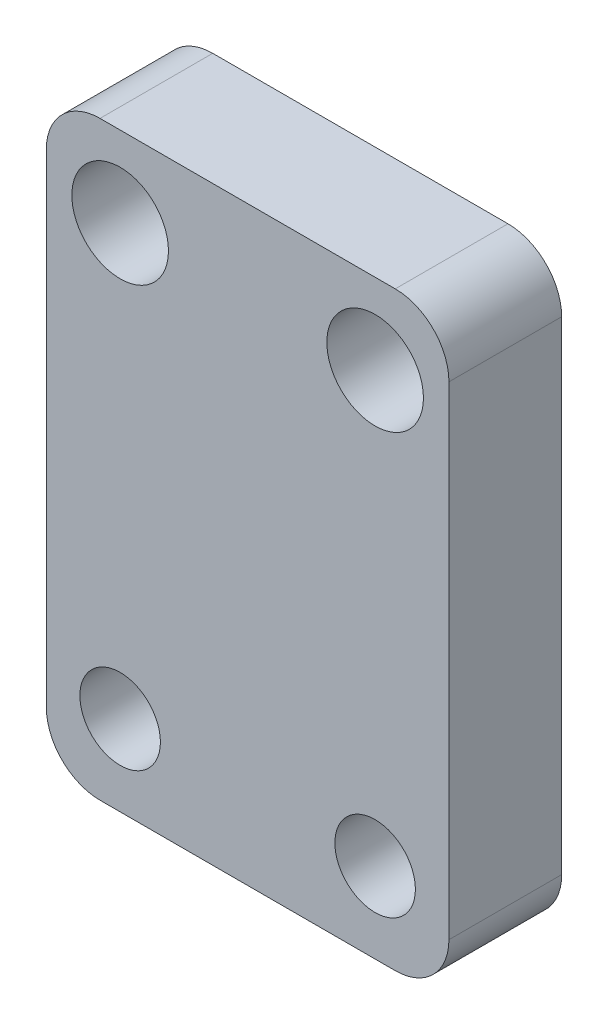
ISO-10303-21;
HEADER;
FILE_DESCRIPTION(('STEP AP214'),'2;1');
FILE_NAME('part.step','',(''),(''),'','','');
FILE_SCHEMA(('AUTOMOTIVE_DESIGN { 1 0 10303 214 1 1 1 1 }'));
ENDSEC;
DATA;
#1=APPLICATION_CONTEXT('core data for automotive mechanical design processes');
#2=APPLICATION_PROTOCOL_DEFINITION('international standard','automotive_design',2000,#1);
#3=PRODUCT_CONTEXT('',#1,'mechanical');
#4=PRODUCT('Part','Part','',(#3));
#5=PRODUCT_RELATED_PRODUCT_CATEGORY('part','',(#4));
#6=PRODUCT_DEFINITION_FORMATION('','',#4);
#7=PRODUCT_DEFINITION_CONTEXT('part definition',#1,'design');
#8=PRODUCT_DEFINITION('design','',#6,#7);
#9=PRODUCT_DEFINITION_SHAPE('','',#8);
#10=(LENGTH_UNIT() NAMED_UNIT(*) SI_UNIT(.MILLI.,.METRE.));
#11=(NAMED_UNIT(*) PLANE_ANGLE_UNIT() SI_UNIT($,.RADIAN.));
#12=(NAMED_UNIT(*) SI_UNIT($,.STERADIAN.) SOLID_ANGLE_UNIT());
#13=UNCERTAINTY_MEASURE_WITH_UNIT(LENGTH_MEASURE(1.E-05),#10,'distance_accuracy_value','');
#14=(GEOMETRIC_REPRESENTATION_CONTEXT(3) GLOBAL_UNCERTAINTY_ASSIGNED_CONTEXT((#13)) GLOBAL_UNIT_ASSIGNED_CONTEXT((#10,
#11,#12)) REPRESENTATION_CONTEXT('',''));
#15=CARTESIAN_POINT('',(0.,0.,0.));
#16=DIRECTION('',(0.,0.,1.));
#17=DIRECTION('',(1.,0.,0.));
#18=AXIS2_PLACEMENT_3D('',#15,#16,#17);
#19=CARTESIAN_POINT('',(0.,0.,4.2));
#20=DIRECTION('',(0.,0.,-1.));
#21=DIRECTION('',(-1.,0.,0.));
#22=AXIS2_PLACEMENT_3D('',#19,#20,#21);
#23=PLANE('',#22);
#24=DIRECTION('',(1.,0.,0.));
#25=VECTOR('',#24,1.);
#26=CARTESIAN_POINT('',(-7.5,-11.,4.2));
#27=LINE('',#26,#25);
#28=CARTESIAN_POINT('',(-5.5,-11.,4.2));
#29=VERTEX_POINT('',#28);
#30=CARTESIAN_POINT('',(5.5,-11.,4.2));
#31=VERTEX_POINT('',#30);
#32=EDGE_CURVE('E156',#29,#31,#27,.T.);
#33=ORIENTED_EDGE('',*,*,#32,.T.);
#34=CARTESIAN_POINT('',(5.5,-9.,4.2));
#35=DIRECTION('',(0.,0.,-1.));
#36=DIRECTION('',(-1.,0.,0.));
#37=AXIS2_PLACEMENT_3D('',#34,#35,#36);
#38=CIRCLE('',#37,2.);
#39=CARTESIAN_POINT('',(7.5,-9.,4.2));
#40=VERTEX_POINT('',#39);
#41=EDGE_CURVE('E185',#31,#40,#38,.F.);
#42=ORIENTED_EDGE('',*,*,#41,.T.);
#43=DIRECTION('',(0.,1.,0.));
#44=VECTOR('',#43,1.);
#45=CARTESIAN_POINT('',(7.5,-11.,4.2));
#46=LINE('',#45,#44);
#47=CARTESIAN_POINT('',(7.5,8.99999999999999,4.2));
#48=VERTEX_POINT('',#47);
#49=EDGE_CURVE('E134',#40,#48,#46,.T.);
#50=ORIENTED_EDGE('',*,*,#49,.T.);
#51=CARTESIAN_POINT('',(5.5,9.,4.2));
#52=DIRECTION('',(0.,0.,-1.));
#53=DIRECTION('',(-1.,0.,0.));
#54=AXIS2_PLACEMENT_3D('',#51,#52,#53);
#55=CIRCLE('',#54,2.);
#56=CARTESIAN_POINT('',(5.5,11.,4.2));
#57=VERTEX_POINT('',#56);
#58=EDGE_CURVE('E179',#48,#57,#55,.F.);
#59=ORIENTED_EDGE('',*,*,#58,.T.);
#60=DIRECTION('',(-1.,0.,0.));
#61=VECTOR('',#60,1.);
#62=CARTESIAN_POINT('',(-7.5,11.,4.2));
#63=LINE('',#62,#61);
#64=CARTESIAN_POINT('',(-5.5,11.,4.2));
#65=VERTEX_POINT('',#64);
#66=EDGE_CURVE('E198',#57,#65,#63,.T.);
#67=ORIENTED_EDGE('',*,*,#66,.T.);
#68=CARTESIAN_POINT('',(-5.5,8.99999999999999,4.2));
#69=DIRECTION('',(0.,0.,-1.));
#70=DIRECTION('',(-1.,0.,0.));
#71=AXIS2_PLACEMENT_3D('',#68,#69,#70);
#72=CIRCLE('',#71,2.);
#73=CARTESIAN_POINT('',(-7.5,8.99999999999999,4.2));
#74=VERTEX_POINT('',#73);
#75=EDGE_CURVE('E68',#65,#74,#72,.F.);
#76=ORIENTED_EDGE('',*,*,#75,.T.);
#77=DIRECTION('',(0.,-1.,0.));
#78=VECTOR('',#77,1.);
#79=CARTESIAN_POINT('',(-7.5,-11.,4.2));
#80=LINE('',#79,#78);
#81=CARTESIAN_POINT('',(-7.5,-9.,4.2));
#82=VERTEX_POINT('',#81);
#83=EDGE_CURVE('E205',#74,#82,#80,.T.);
#84=ORIENTED_EDGE('',*,*,#83,.T.);
#85=CARTESIAN_POINT('',(-5.5,-9.,4.2));
#86=DIRECTION('',(0.,0.,-1.));
#87=DIRECTION('',(-1.,0.,0.));
#88=AXIS2_PLACEMENT_3D('',#85,#86,#87);
#89=CIRCLE('',#88,2.);
#90=EDGE_CURVE('E182',#82,#29,#89,.F.);
#91=ORIENTED_EDGE('',*,*,#90,.T.);
#92=EDGE_LOOP('',(#33,#42,#50,#59,#67,#76,#84,#91));
#93=FACE_BOUND('',#92,.T.);
#94=CARTESIAN_POINT('',(-4.75,8.,4.2));
#95=DIRECTION('',(0.,0.,1.));
#96=DIRECTION('',(1.,0.,0.));
#97=AXIS2_PLACEMENT_3D('',#94,#95,#96);
#98=CIRCLE('',#97,1.8);
#99=CARTESIAN_POINT('',(-2.95,8.,4.2));
#100=VERTEX_POINT('',#99);
#101=EDGE_CURVE('E145',#100,#100,#98,.T.);
#102=ORIENTED_EDGE('',*,*,#101,.F.);
#103=EDGE_LOOP('',(#102));
#104=FACE_BOUND('',#103,.T.);
#105=CARTESIAN_POINT('',(4.75,8.,4.2));
#106=DIRECTION('',(0.,0.,1.));
#107=DIRECTION('',(1.,0.,0.));
#108=AXIS2_PLACEMENT_3D('',#105,#106,#107);
#109=CIRCLE('',#108,1.8);
#110=CARTESIAN_POINT('',(6.55,8.,4.2));
#111=VERTEX_POINT('',#110);
#112=EDGE_CURVE('E224',#111,#111,#109,.T.);
#113=ORIENTED_EDGE('',*,*,#112,.F.);
#114=EDGE_LOOP('',(#113));
#115=FACE_BOUND('',#114,.T.);
#116=CARTESIAN_POINT('',(-4.75,-8.,4.2));
#117=DIRECTION('',(0.,0.,1.));
#118=DIRECTION('',(1.,0.,0.));
#119=AXIS2_PLACEMENT_3D('',#116,#117,#118);
#120=CIRCLE('',#119,1.5);
#121=CARTESIAN_POINT('',(-3.25,-8.,4.2));
#122=VERTEX_POINT('',#121);
#123=EDGE_CURVE('E230',#122,#122,#120,.T.);
#124=ORIENTED_EDGE('',*,*,#123,.F.);
#125=EDGE_LOOP('',(#124));
#126=FACE_BOUND('',#125,.T.);
#127=CARTESIAN_POINT('',(4.75,-8.,4.2));
#128=DIRECTION('',(0.,0.,1.));
#129=DIRECTION('',(1.,0.,0.));
#130=AXIS2_PLACEMENT_3D('',#127,#128,#129);
#131=CIRCLE('',#130,1.5);
#132=CARTESIAN_POINT('',(6.25,-8.,4.2));
#133=VERTEX_POINT('',#132);
#134=EDGE_CURVE('E238',#133,#133,#131,.T.);
#135=ORIENTED_EDGE('',*,*,#134,.F.);
#136=EDGE_LOOP('',(#135));
#137=FACE_BOUND('',#136,.T.);
#138=ADVANCED_FACE('F45',(#93,#104,#115,#126,#137),#23,.F.);
#139=CARTESIAN_POINT('',(0.,0.,0.));
#140=DIRECTION('',(0.,0.,-1.));
#141=DIRECTION('',(-1.,0.,0.));
#142=AXIS2_PLACEMENT_3D('',#139,#140,#141);
#143=PLANE('',#142);
#144=CARTESIAN_POINT('',(-4.75,-8.,0.));
#145=DIRECTION('',(0.,0.,1.));
#146=DIRECTION('',(1.,0.,0.));
#147=AXIS2_PLACEMENT_3D('',#144,#145,#146);
#148=CIRCLE('',#147,1.5);
#149=CARTESIAN_POINT('',(-3.25,-8.,0.));
#150=VERTEX_POINT('',#149);
#151=EDGE_CURVE('E234',#150,#150,#148,.T.);
#152=ORIENTED_EDGE('',*,*,#151,.T.);
#153=EDGE_LOOP('',(#152));
#154=FACE_BOUND('',#153,.T.);
#155=CARTESIAN_POINT('',(-4.75,8.,0.));
#156=DIRECTION('',(0.,0.,1.));
#157=DIRECTION('',(1.,0.,0.));
#158=AXIS2_PLACEMENT_3D('',#155,#156,#157);
#159=CIRCLE('',#158,1.8);
#160=CARTESIAN_POINT('',(-2.95,8.,0.));
#161=VERTEX_POINT('',#160);
#162=EDGE_CURVE('E153',#161,#161,#159,.T.);
#163=ORIENTED_EDGE('',*,*,#162,.T.);
#164=EDGE_LOOP('',(#163));
#165=FACE_BOUND('',#164,.T.);
#166=DIRECTION('',(0.,1.,0.));
#167=VECTOR('',#166,1.);
#168=CARTESIAN_POINT('',(7.5,-11.,0.));
#169=LINE('',#168,#167);
#170=CARTESIAN_POINT('',(7.5,-9.,0.));
#171=VERTEX_POINT('',#170);
#172=CARTESIAN_POINT('',(7.5,8.99999999999999,0.));
#173=VERTEX_POINT('',#172);
#174=EDGE_CURVE('E131',#171,#173,#169,.T.);
#175=ORIENTED_EDGE('',*,*,#174,.F.);
#176=CARTESIAN_POINT('',(5.5,-9.,0.));
#177=DIRECTION('',(0.,0.,-1.));
#178=DIRECTION('',(-1.,0.,0.));
#179=AXIS2_PLACEMENT_3D('',#176,#177,#178);
#180=CIRCLE('',#179,2.);
#181=CARTESIAN_POINT('',(5.5,-11.,0.));
#182=VERTEX_POINT('',#181);
#183=EDGE_CURVE('E113',#171,#182,#180,.T.);
#184=ORIENTED_EDGE('',*,*,#183,.T.);
#185=DIRECTION('',(1.,0.,0.));
#186=VECTOR('',#185,1.);
#187=CARTESIAN_POINT('',(-7.5,-11.,0.));
#188=LINE('',#187,#186);
#189=CARTESIAN_POINT('',(-5.5,-11.,0.));
#190=VERTEX_POINT('',#189);
#191=EDGE_CURVE('E161',#190,#182,#188,.T.);
#192=ORIENTED_EDGE('',*,*,#191,.F.);
#193=CARTESIAN_POINT('',(-5.5,-9.,0.));
#194=DIRECTION('',(0.,0.,-1.));
#195=DIRECTION('',(-1.,0.,0.));
#196=AXIS2_PLACEMENT_3D('',#193,#194,#195);
#197=CIRCLE('',#196,2.);
#198=CARTESIAN_POINT('',(-7.5,-9.,0.));
#199=VERTEX_POINT('',#198);
#200=EDGE_CURVE('E125',#190,#199,#197,.T.);
#201=ORIENTED_EDGE('',*,*,#200,.T.);
#202=DIRECTION('',(0.,-1.,0.));
#203=VECTOR('',#202,1.);
#204=CARTESIAN_POINT('',(-7.5,-11.,0.));
#205=LINE('',#204,#203);
#206=CARTESIAN_POINT('',(-7.5,8.99999999999999,0.));
#207=VERTEX_POINT('',#206);
#208=EDGE_CURVE('E150',#207,#199,#205,.T.);
#209=ORIENTED_EDGE('',*,*,#208,.F.);
#210=CARTESIAN_POINT('',(-5.5,8.99999999999999,0.));
#211=DIRECTION('',(0.,0.,-1.));
#212=DIRECTION('',(-1.,0.,0.));
#213=AXIS2_PLACEMENT_3D('',#210,#211,#212);
#214=CIRCLE('',#213,2.);
#215=CARTESIAN_POINT('',(-5.5,11.,0.));
#216=VERTEX_POINT('',#215);
#217=EDGE_CURVE('E136',#207,#216,#214,.T.);
#218=ORIENTED_EDGE('',*,*,#217,.T.);
#219=DIRECTION('',(-1.,0.,0.));
#220=VECTOR('',#219,1.);
#221=CARTESIAN_POINT('',(-7.5,11.,0.));
#222=LINE('',#221,#220);
#223=CARTESIAN_POINT('',(5.5,11.,0.));
#224=VERTEX_POINT('',#223);
#225=EDGE_CURVE('E144',#224,#216,#222,.T.);
#226=ORIENTED_EDGE('',*,*,#225,.F.);
#227=CARTESIAN_POINT('',(5.5,9.,0.));
#228=DIRECTION('',(0.,0.,-1.));
#229=DIRECTION('',(-1.,0.,0.));
#230=AXIS2_PLACEMENT_3D('',#227,#228,#229);
#231=CIRCLE('',#230,2.);
#232=EDGE_CURVE('E142',#224,#173,#231,.T.);
#233=ORIENTED_EDGE('',*,*,#232,.T.);
#234=EDGE_LOOP('',(#175,#184,#192,#201,#209,#218,#226,#233));
#235=FACE_BOUND('',#234,.T.);
#236=CARTESIAN_POINT('',(4.75,8.,0.));
#237=DIRECTION('',(0.,0.,1.));
#238=DIRECTION('',(1.,0.,0.));
#239=AXIS2_PLACEMENT_3D('',#236,#237,#238);
#240=CIRCLE('',#239,1.8);
#241=CARTESIAN_POINT('',(6.55,8.,0.));
#242=VERTEX_POINT('',#241);
#243=EDGE_CURVE('E226',#242,#242,#240,.T.);
#244=ORIENTED_EDGE('',*,*,#243,.T.);
#245=EDGE_LOOP('',(#244));
#246=FACE_BOUND('',#245,.T.);
#247=CARTESIAN_POINT('',(4.75,-8.,0.));
#248=DIRECTION('',(0.,0.,1.));
#249=DIRECTION('',(1.,0.,0.));
#250=AXIS2_PLACEMENT_3D('',#247,#248,#249);
#251=CIRCLE('',#250,1.5);
#252=CARTESIAN_POINT('',(6.25,-8.,0.));
#253=VERTEX_POINT('',#252);
#254=EDGE_CURVE('E242',#253,#253,#251,.T.);
#255=ORIENTED_EDGE('',*,*,#254,.T.);
#256=EDGE_LOOP('',(#255));
#257=FACE_BOUND('',#256,.T.);
#258=ADVANCED_FACE('F139',(#154,#165,#235,#246,#257),#143,.T.);
#259=CARTESIAN_POINT('',(7.5,-11.,4.2));
#260=DIRECTION('',(-1.,0.,0.));
#261=DIRECTION('',(0.,-1.,0.));
#262=AXIS2_PLACEMENT_3D('',#259,#260,#261);
#263=PLANE('',#262);
#264=ORIENTED_EDGE('',*,*,#49,.F.);
#265=DIRECTION('',(0.,0.,-1.));
#266=VECTOR('',#265,1.);
#267=CARTESIAN_POINT('',(7.5,-9.,4.2));
#268=LINE('',#267,#266);
#269=EDGE_CURVE('E117',#40,#171,#268,.T.);
#270=ORIENTED_EDGE('',*,*,#269,.T.);
#271=ORIENTED_EDGE('',*,*,#174,.T.);
#272=DIRECTION('',(0.,0.,-1.));
#273=VECTOR('',#272,1.);
#274=CARTESIAN_POINT('',(7.5,8.99999999999999,4.2));
#275=LINE('',#274,#273);
#276=EDGE_CURVE('E137',#173,#48,#275,.F.);
#277=ORIENTED_EDGE('',*,*,#276,.T.);
#278=EDGE_LOOP('',(#264,#270,#271,#277));
#279=FACE_BOUND('',#278,.T.);
#280=ADVANCED_FACE('F130',(#279),#263,.F.);
#281=CARTESIAN_POINT('',(-7.5,11.,4.2));
#282=DIRECTION('',(0.,-1.,0.));
#283=DIRECTION('',(0.,0.,-1.));
#284=AXIS2_PLACEMENT_3D('',#281,#282,#283);
#285=PLANE('',#284);
#286=ORIENTED_EDGE('',*,*,#66,.F.);
#287=DIRECTION('',(0.,0.,-1.));
#288=VECTOR('',#287,1.);
#289=CARTESIAN_POINT('',(5.5,11.,4.2));
#290=LINE('',#289,#288);
#291=EDGE_CURVE('E11',#57,#224,#290,.T.);
#292=ORIENTED_EDGE('',*,*,#291,.T.);
#293=ORIENTED_EDGE('',*,*,#225,.T.);
#294=DIRECTION('',(0.,0.,-1.));
#295=VECTOR('',#294,1.);
#296=CARTESIAN_POINT('',(-5.5,11.,4.2));
#297=LINE('',#296,#295);
#298=EDGE_CURVE('E54',#216,#65,#297,.F.);
#299=ORIENTED_EDGE('',*,*,#298,.T.);
#300=EDGE_LOOP('',(#286,#292,#293,#299));
#301=FACE_BOUND('',#300,.T.);
#302=ADVANCED_FACE('F197',(#301),#285,.F.);
#303=CARTESIAN_POINT('',(-7.5,-11.,4.2));
#304=DIRECTION('',(1.,0.,0.));
#305=DIRECTION('',(0.,1.,0.));
#306=AXIS2_PLACEMENT_3D('',#303,#304,#305);
#307=PLANE('',#306);
#308=ORIENTED_EDGE('',*,*,#208,.T.);
#309=DIRECTION('',(0.,0.,-1.));
#310=VECTOR('',#309,1.);
#311=CARTESIAN_POINT('',(-7.5,-9.,4.2));
#312=LINE('',#311,#310);
#313=EDGE_CURVE('E61',#199,#82,#312,.F.);
#314=ORIENTED_EDGE('',*,*,#313,.T.);
#315=ORIENTED_EDGE('',*,*,#83,.F.);
#316=DIRECTION('',(0.,0.,-1.));
#317=VECTOR('',#316,1.);
#318=CARTESIAN_POINT('',(-7.5,8.99999999999999,4.2));
#319=LINE('',#318,#317);
#320=EDGE_CURVE('E188',#74,#207,#319,.T.);
#321=ORIENTED_EDGE('',*,*,#320,.T.);
#322=EDGE_LOOP('',(#308,#314,#315,#321));
#323=FACE_BOUND('',#322,.T.);
#324=ADVANCED_FACE('F209',(#323),#307,.F.);
#325=CARTESIAN_POINT('',(-7.5,-11.,4.2));
#326=DIRECTION('',(0.,1.,0.));
#327=DIRECTION('',(0.,0.,1.));
#328=AXIS2_PLACEMENT_3D('',#325,#326,#327);
#329=PLANE('',#328);
#330=ORIENTED_EDGE('',*,*,#191,.T.);
#331=DIRECTION('',(0.,0.,-1.));
#332=VECTOR('',#331,1.);
#333=CARTESIAN_POINT('',(5.5,-11.,4.2));
#334=LINE('',#333,#332);
#335=EDGE_CURVE('E118',#182,#31,#334,.F.);
#336=ORIENTED_EDGE('',*,*,#335,.T.);
#337=ORIENTED_EDGE('',*,*,#32,.F.);
#338=DIRECTION('',(0.,0.,-1.));
#339=VECTOR('',#338,1.);
#340=CARTESIAN_POINT('',(-5.5,-11.,4.2));
#341=LINE('',#340,#339);
#342=EDGE_CURVE('E124',#29,#190,#341,.T.);
#343=ORIENTED_EDGE('',*,*,#342,.T.);
#344=EDGE_LOOP('',(#330,#336,#337,#343));
#345=FACE_BOUND('',#344,.T.);
#346=ADVANCED_FACE('F216',(#345),#329,.F.);
#347=CARTESIAN_POINT('',(-4.75,8.,4.2));
#348=DIRECTION('',(0.,0.,-1.));
#349=DIRECTION('',(-1.,0.,0.));
#350=AXIS2_PLACEMENT_3D('',#347,#348,#349);
#351=CYLINDRICAL_SURFACE('',#350,1.8);
#352=ORIENTED_EDGE('',*,*,#101,.T.);
#353=EDGE_LOOP('',(#352));
#354=FACE_BOUND('',#353,.T.);
#355=ORIENTED_EDGE('',*,*,#162,.F.);
#356=EDGE_LOOP('',(#355));
#357=FACE_BOUND('',#356,.T.);
#358=ADVANCED_FACE('F262',(#354,#357),#351,.F.);
#359=CARTESIAN_POINT('',(4.75,8.,4.2));
#360=DIRECTION('',(0.,0.,-1.));
#361=DIRECTION('',(-1.,0.,0.));
#362=AXIS2_PLACEMENT_3D('',#359,#360,#361);
#363=CYLINDRICAL_SURFACE('',#362,1.8);
#364=ORIENTED_EDGE('',*,*,#112,.T.);
#365=EDGE_LOOP('',(#364));
#366=FACE_BOUND('',#365,.T.);
#367=ORIENTED_EDGE('',*,*,#243,.F.);
#368=EDGE_LOOP('',(#367));
#369=FACE_BOUND('',#368,.T.);
#370=ADVANCED_FACE('F318',(#366,#369),#363,.F.);
#371=CARTESIAN_POINT('',(-4.75,-8.,4.2));
#372=DIRECTION('',(0.,0.,-1.));
#373=DIRECTION('',(-1.,0.,0.));
#374=AXIS2_PLACEMENT_3D('',#371,#372,#373);
#375=CYLINDRICAL_SURFACE('',#374,1.5);
#376=ORIENTED_EDGE('',*,*,#123,.T.);
#377=EDGE_LOOP('',(#376));
#378=FACE_BOUND('',#377,.T.);
#379=ORIENTED_EDGE('',*,*,#151,.F.);
#380=EDGE_LOOP('',(#379));
#381=FACE_BOUND('',#380,.T.);
#382=ADVANCED_FACE('F309',(#378,#381),#375,.F.);
#383=CARTESIAN_POINT('',(4.75,-8.,4.2));
#384=DIRECTION('',(0.,0.,-1.));
#385=DIRECTION('',(-1.,0.,0.));
#386=AXIS2_PLACEMENT_3D('',#383,#384,#385);
#387=CYLINDRICAL_SURFACE('',#386,1.5);
#388=ORIENTED_EDGE('',*,*,#134,.T.);
#389=EDGE_LOOP('',(#388));
#390=FACE_BOUND('',#389,.T.);
#391=ORIENTED_EDGE('',*,*,#254,.F.);
#392=EDGE_LOOP('',(#391));
#393=FACE_BOUND('',#392,.T.);
#394=ADVANCED_FACE('F250',(#390,#393),#387,.F.);
#395=CARTESIAN_POINT('',(5.5,-9.,4.2));
#396=DIRECTION('',(0.,0.,-1.));
#397=DIRECTION('',(-1.,0.,0.));
#398=AXIS2_PLACEMENT_3D('',#395,#396,#397);
#399=CYLINDRICAL_SURFACE('',#398,2.);
#400=ORIENTED_EDGE('',*,*,#41,.F.);
#401=ORIENTED_EDGE('',*,*,#335,.F.);
#402=ORIENTED_EDGE('',*,*,#183,.F.);
#403=ORIENTED_EDGE('',*,*,#269,.F.);
#404=EDGE_LOOP('',(#400,#401,#402,#403));
#405=FACE_BOUND('',#404,.T.);
#406=ADVANCED_FACE('F116',(#405),#399,.T.);
#407=CARTESIAN_POINT('',(-5.5,-9.,4.2));
#408=DIRECTION('',(0.,0.,-1.));
#409=DIRECTION('',(-1.,0.,0.));
#410=AXIS2_PLACEMENT_3D('',#407,#408,#409);
#411=CYLINDRICAL_SURFACE('',#410,2.);
#412=ORIENTED_EDGE('',*,*,#90,.F.);
#413=ORIENTED_EDGE('',*,*,#313,.F.);
#414=ORIENTED_EDGE('',*,*,#200,.F.);
#415=ORIENTED_EDGE('',*,*,#342,.F.);
#416=EDGE_LOOP('',(#412,#413,#414,#415));
#417=FACE_BOUND('',#416,.T.);
#418=ADVANCED_FACE('F213',(#417),#411,.T.);
#419=CARTESIAN_POINT('',(5.5,9.,4.2));
#420=DIRECTION('',(0.,0.,-1.));
#421=DIRECTION('',(-1.,0.,0.));
#422=AXIS2_PLACEMENT_3D('',#419,#420,#421);
#423=CYLINDRICAL_SURFACE('',#422,2.);
#424=ORIENTED_EDGE('',*,*,#58,.F.);
#425=ORIENTED_EDGE('',*,*,#276,.F.);
#426=ORIENTED_EDGE('',*,*,#232,.F.);
#427=ORIENTED_EDGE('',*,*,#291,.F.);
#428=EDGE_LOOP('',(#424,#425,#426,#427));
#429=FACE_BOUND('',#428,.T.);
#430=ADVANCED_FACE('F276',(#429),#423,.T.);
#431=CARTESIAN_POINT('',(-5.5,8.99999999999999,4.2));
#432=DIRECTION('',(0.,0.,-1.));
#433=DIRECTION('',(-1.,0.,0.));
#434=AXIS2_PLACEMENT_3D('',#431,#432,#433);
#435=CYLINDRICAL_SURFACE('',#434,2.);
#436=ORIENTED_EDGE('',*,*,#75,.F.);
#437=ORIENTED_EDGE('',*,*,#298,.F.);
#438=ORIENTED_EDGE('',*,*,#217,.F.);
#439=ORIENTED_EDGE('',*,*,#320,.F.);
#440=EDGE_LOOP('',(#436,#437,#438,#439));
#441=FACE_BOUND('',#440,.T.);
#442=ADVANCED_FACE('F47',(#441),#435,.T.);
#443=CLOSED_SHELL('',(#138,#258,#280,#302,#324,#346,#358,#370,#382,#394,#406,#418,#430,#442));
#444=MANIFOLD_SOLID_BREP('B2',#443);
#445=ADVANCED_BREP_SHAPE_REPRESENTATION('',(#18,#444),#14);
#446=SHAPE_DEFINITION_REPRESENTATION(#9,#445);
ENDSEC;
END-ISO-10303-21;
